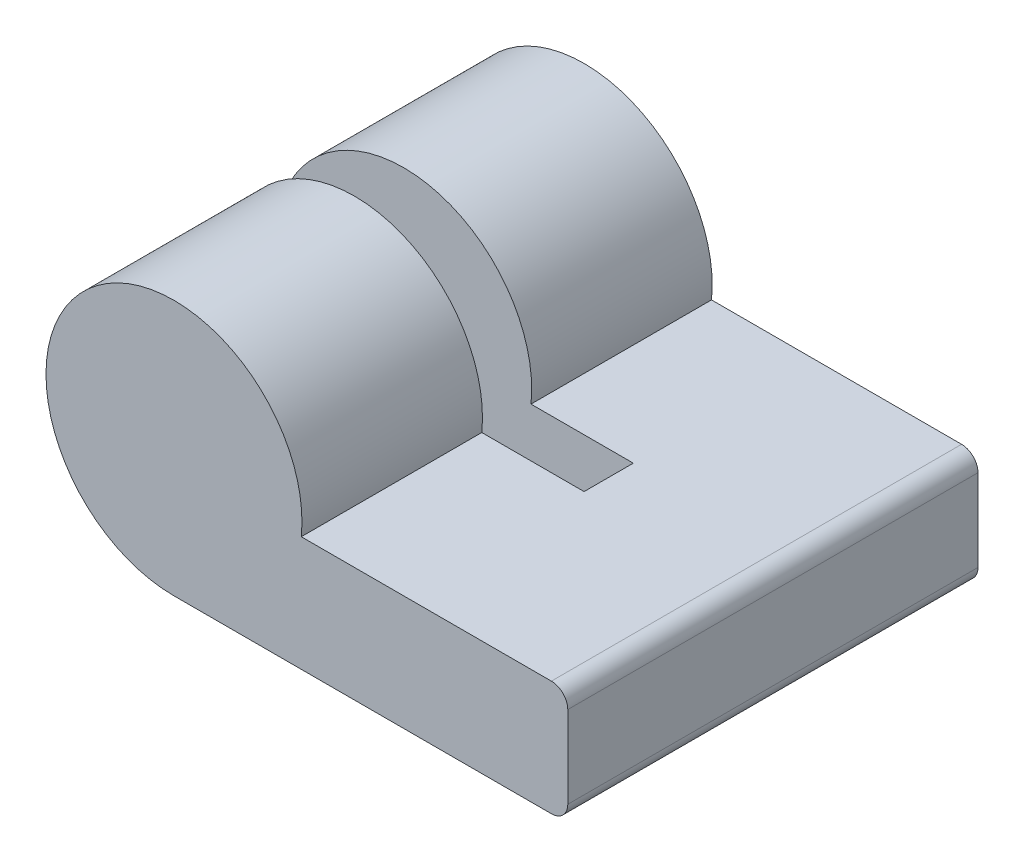
ISO-10303-21;
HEADER;
FILE_DESCRIPTION(('STEP AP214'),'2;1');
FILE_NAME('part.step','',(''),(''),'','','');
FILE_SCHEMA(('AUTOMOTIVE_DESIGN { 1 0 10303 214 1 1 1 1 }'));
ENDSEC;
DATA;
#1=APPLICATION_CONTEXT('core data for automotive mechanical design processes');
#2=APPLICATION_PROTOCOL_DEFINITION('international standard','automotive_design',2000,#1);
#3=PRODUCT_CONTEXT('',#1,'mechanical');
#4=PRODUCT('Part','Part','',(#3));
#5=PRODUCT_RELATED_PRODUCT_CATEGORY('part','',(#4));
#6=PRODUCT_DEFINITION_FORMATION('','',#4);
#7=PRODUCT_DEFINITION_CONTEXT('part definition',#1,'design');
#8=PRODUCT_DEFINITION('design','',#6,#7);
#9=PRODUCT_DEFINITION_SHAPE('','',#8);
#10=(LENGTH_UNIT() NAMED_UNIT(*) SI_UNIT(.MILLI.,.METRE.));
#11=(NAMED_UNIT(*) PLANE_ANGLE_UNIT() SI_UNIT($,.RADIAN.));
#12=(NAMED_UNIT(*) SI_UNIT($,.STERADIAN.) SOLID_ANGLE_UNIT());
#13=UNCERTAINTY_MEASURE_WITH_UNIT(LENGTH_MEASURE(1.E-05),#10,'distance_accuracy_value','');
#14=(GEOMETRIC_REPRESENTATION_CONTEXT(3) GLOBAL_UNCERTAINTY_ASSIGNED_CONTEXT((#13)) GLOBAL_UNIT_ASSIGNED_CONTEXT((#10,
#11,#12)) REPRESENTATION_CONTEXT('',''));
#15=CARTESIAN_POINT('',(0.,0.,0.));
#16=DIRECTION('',(0.,0.,1.));
#17=DIRECTION('',(1.,0.,0.));
#18=AXIS2_PLACEMENT_3D('',#15,#16,#17);
#19=CARTESIAN_POINT('',(0.,0.,12.5));
#20=DIRECTION('',(0.,0.,-1.));
#21=DIRECTION('',(-1.,0.,0.));
#22=AXIS2_PLACEMENT_3D('',#19,#20,#21);
#23=CYLINDRICAL_SURFACE('',#22,3.9);
#24=CARTESIAN_POINT('',(0.,0.,5.5));
#25=DIRECTION('',(0.,0.,1.));
#26=DIRECTION('',(1.,0.,0.));
#27=AXIS2_PLACEMENT_3D('',#24,#25,#26);
#28=CIRCLE('',#27,3.9);
#29=CARTESIAN_POINT('',(3.87943294825416,-0.400000000000001,5.5));
#30=VERTEX_POINT('',#29);
#31=CARTESIAN_POINT('',(0.,-3.9,5.5));
#32=VERTEX_POINT('',#31);
#33=EDGE_CURVE('E129',#30,#32,#28,.T.);
#34=ORIENTED_EDGE('',*,*,#33,.F.);
#35=DIRECTION('',(0.,0.,-1.));
#36=VECTOR('',#35,1.);
#37=CARTESIAN_POINT('',(3.87943294825416,-0.400000000000001,12.5));
#38=LINE('',#37,#36);
#39=CARTESIAN_POINT('',(3.87943294825416,-0.400000000000001,0.));
#40=VERTEX_POINT('',#39);
#41=EDGE_CURVE('E156',#30,#40,#38,.T.);
#42=ORIENTED_EDGE('',*,*,#41,.T.);
#43=CARTESIAN_POINT('',(0.,0.,0.));
#44=DIRECTION('',(0.,0.,1.));
#45=DIRECTION('',(1.,0.,0.));
#46=AXIS2_PLACEMENT_3D('',#43,#44,#45);
#47=CIRCLE('',#46,3.9);
#48=CARTESIAN_POINT('',(0.,-3.9,0.));
#49=VERTEX_POINT('',#48);
#50=EDGE_CURVE('E118',#40,#49,#47,.T.);
#51=ORIENTED_EDGE('',*,*,#50,.T.);
#52=DIRECTION('',(0.,0.,-1.));
#53=VECTOR('',#52,1.);
#54=CARTESIAN_POINT('',(0.,-3.9,12.5));
#55=LINE('',#54,#53);
#56=EDGE_CURVE('E160',#32,#49,#55,.T.);
#57=ORIENTED_EDGE('',*,*,#56,.F.);
#58=EDGE_LOOP('',(#34,#42,#51,#57));
#59=FACE_BOUND('',#58,.T.);
#60=ADVANCED_FACE('F31',(#59),#23,.T.);
#61=CARTESIAN_POINT('',(0.,-3.9,12.5));
#62=DIRECTION('',(0.,1.,0.));
#63=DIRECTION('',(0.,0.,1.));
#64=AXIS2_PLACEMENT_3D('',#61,#62,#63);
#65=PLANE('',#64);
#66=DIRECTION('',(1.,0.,0.));
#67=VECTOR('',#66,1.);
#68=CARTESIAN_POINT('',(0.,-3.9,5.5));
#69=LINE('',#68,#67);
#70=CARTESIAN_POINT('',(3.13256738578406,-3.9,5.5));
#71=VERTEX_POINT('',#70);
#72=EDGE_CURVE('E119',#32,#71,#69,.T.);
#73=ORIENTED_EDGE('',*,*,#72,.F.);
#74=ORIENTED_EDGE('',*,*,#56,.T.);
#75=DIRECTION('',(1.,0.,0.));
#76=VECTOR('',#75,1.);
#77=CARTESIAN_POINT('',(0.,-3.9,0.));
#78=LINE('',#77,#76);
#79=CARTESIAN_POINT('',(11.5,-3.9,0.));
#80=VERTEX_POINT('',#79);
#81=EDGE_CURVE('E138',#49,#80,#78,.T.);
#82=ORIENTED_EDGE('',*,*,#81,.T.);
#83=DIRECTION('',(0.,0.,-1.));
#84=VECTOR('',#83,1.);
#85=CARTESIAN_POINT('',(11.5,-3.9,12.5));
#86=LINE('',#85,#84);
#87=CARTESIAN_POINT('',(11.5,-3.9,12.5));
#88=VERTEX_POINT('',#87);
#89=EDGE_CURVE('E54',#80,#88,#86,.F.);
#90=ORIENTED_EDGE('',*,*,#89,.T.);
#91=DIRECTION('',(1.,0.,0.));
#92=VECTOR('',#91,1.);
#93=CARTESIAN_POINT('',(0.,-3.9,12.5));
#94=LINE('',#93,#92);
#95=CARTESIAN_POINT('',(0.,-3.9,12.5));
#96=VERTEX_POINT('',#95);
#97=EDGE_CURVE('E149',#96,#88,#94,.T.);
#98=ORIENTED_EDGE('',*,*,#97,.F.);
#99=CARTESIAN_POINT('',(0.,-3.9,7.));
#100=VERTEX_POINT('',#99);
#101=EDGE_CURVE('E128',#96,#100,#55,.T.);
#102=ORIENTED_EDGE('',*,*,#101,.T.);
#103=DIRECTION('',(1.,0.,0.));
#104=VECTOR('',#103,1.);
#105=CARTESIAN_POINT('',(0.,-3.9,7.));
#106=LINE('',#105,#104);
#107=CARTESIAN_POINT('',(3.13256738578406,-3.9,7.));
#108=VERTEX_POINT('',#107);
#109=EDGE_CURVE('E122',#100,#108,#106,.T.);
#110=ORIENTED_EDGE('',*,*,#109,.T.);
#111=DIRECTION('',(0.,0.,1.));
#112=VECTOR('',#111,1.);
#113=CARTESIAN_POINT('',(3.13256738578406,-3.9,5.5));
#114=LINE('',#113,#112);
#115=EDGE_CURVE('E109',#108,#71,#114,.F.);
#116=ORIENTED_EDGE('',*,*,#115,.T.);
#117=EDGE_LOOP('',(#73,#74,#82,#90,#98,#102,#110,#116));
#118=FACE_BOUND('',#117,.T.);
#119=ADVANCED_FACE('F126',(#118),#65,.F.);
#120=CARTESIAN_POINT('',(12.,-0.4,12.5));
#121=DIRECTION('',(0.,-1.,0.));
#122=DIRECTION('',(1.,0.,0.));
#123=AXIS2_PLACEMENT_3D('',#120,#121,#122);
#124=PLANE('',#123);
#125=DIRECTION('',(-1.,0.,0.));
#126=VECTOR('',#125,1.);
#127=CARTESIAN_POINT('',(12.,-0.4,5.5));
#128=LINE('',#127,#126);
#129=CARTESIAN_POINT('',(6.99636333578803,-0.400000000000002,5.5));
#130=VERTEX_POINT('',#129);
#131=EDGE_CURVE('E11',#130,#30,#128,.T.);
#132=ORIENTED_EDGE('',*,*,#131,.F.);
#133=DIRECTION('',(0.,0.,1.));
#134=VECTOR('',#133,1.);
#135=CARTESIAN_POINT('',(6.99636333578803,-0.400000000000002,5.5));
#136=LINE('',#135,#134);
#137=CARTESIAN_POINT('',(6.99636333578803,-0.400000000000002,7.));
#138=VERTEX_POINT('',#137);
#139=EDGE_CURVE('E39',#130,#138,#136,.T.);
#140=ORIENTED_EDGE('',*,*,#139,.T.);
#141=DIRECTION('',(-1.,0.,0.));
#142=VECTOR('',#141,1.);
#143=CARTESIAN_POINT('',(12.,-0.4,7.));
#144=LINE('',#143,#142);
#145=CARTESIAN_POINT('',(3.87943294825416,-0.400000000000001,7.));
#146=VERTEX_POINT('',#145);
#147=EDGE_CURVE('E123',#138,#146,#144,.T.);
#148=ORIENTED_EDGE('',*,*,#147,.T.);
#149=CARTESIAN_POINT('',(3.87943294825416,-0.400000000000001,12.5));
#150=VERTEX_POINT('',#149);
#151=EDGE_CURVE('E157',#150,#146,#38,.T.);
#152=ORIENTED_EDGE('',*,*,#151,.F.);
#153=DIRECTION('',(-1.,0.,0.));
#154=VECTOR('',#153,1.);
#155=CARTESIAN_POINT('',(12.,-0.4,12.5));
#156=LINE('',#155,#154);
#157=CARTESIAN_POINT('',(11.5,-0.4,12.5));
#158=VERTEX_POINT('',#157);
#159=EDGE_CURVE('E154',#158,#150,#156,.T.);
#160=ORIENTED_EDGE('',*,*,#159,.F.);
#161=DIRECTION('',(0.,0.,-1.));
#162=VECTOR('',#161,1.);
#163=CARTESIAN_POINT('',(11.5,-0.4,12.5));
#164=LINE('',#163,#162);
#165=CARTESIAN_POINT('',(11.5,-0.4,0.));
#166=VERTEX_POINT('',#165);
#167=EDGE_CURVE('E162',#158,#166,#164,.T.);
#168=ORIENTED_EDGE('',*,*,#167,.T.);
#169=DIRECTION('',(-1.,0.,0.));
#170=VECTOR('',#169,1.);
#171=CARTESIAN_POINT('',(12.,-0.4,0.));
#172=LINE('',#171,#170);
#173=EDGE_CURVE('E143',#166,#40,#172,.T.);
#174=ORIENTED_EDGE('',*,*,#173,.T.);
#175=ORIENTED_EDGE('',*,*,#41,.F.);
#176=EDGE_LOOP('',(#132,#140,#148,#152,#160,#168,#174,#175));
#177=FACE_BOUND('',#176,.T.);
#178=ADVANCED_FACE('F181',(#177),#124,.F.);
#179=ORIENTED_EDGE('',*,*,#151,.T.);
#180=CARTESIAN_POINT('',(0.,0.,7.));
#181=DIRECTION('',(0.,0.,1.));
#182=DIRECTION('',(1.,0.,0.));
#183=AXIS2_PLACEMENT_3D('',#180,#181,#182);
#184=CIRCLE('',#183,3.9);
#185=EDGE_CURVE('E46',#146,#100,#184,.T.);
#186=ORIENTED_EDGE('',*,*,#185,.T.);
#187=ORIENTED_EDGE('',*,*,#101,.F.);
#188=CARTESIAN_POINT('',(0.,0.,12.5));
#189=DIRECTION('',(0.,0.,1.));
#190=DIRECTION('',(1.,0.,0.));
#191=AXIS2_PLACEMENT_3D('',#188,#189,#190);
#192=CIRCLE('',#191,3.9);
#193=EDGE_CURVE('E146',#150,#96,#192,.T.);
#194=ORIENTED_EDGE('',*,*,#193,.F.);
#195=EDGE_LOOP('',(#179,#186,#187,#194));
#196=FACE_BOUND('',#195,.T.);
#197=ADVANCED_FACE('F33',(#196),#23,.T.);
#198=CARTESIAN_POINT('',(12.,-3.9,12.5));
#199=DIRECTION('',(-1.,0.,0.));
#200=DIRECTION('',(0.,0.,1.));
#201=AXIS2_PLACEMENT_3D('',#198,#199,#200);
#202=PLANE('',#201);
#203=DIRECTION('',(0.,1.,0.));
#204=VECTOR('',#203,1.);
#205=CARTESIAN_POINT('',(12.,-3.9,0.));
#206=LINE('',#205,#204);
#207=CARTESIAN_POINT('',(12.,-3.4,0.));
#208=VERTEX_POINT('',#207);
#209=CARTESIAN_POINT('',(12.,-0.9,0.));
#210=VERTEX_POINT('',#209);
#211=EDGE_CURVE('E140',#208,#210,#206,.T.);
#212=ORIENTED_EDGE('',*,*,#211,.T.);
#213=DIRECTION('',(0.,0.,-1.));
#214=VECTOR('',#213,1.);
#215=CARTESIAN_POINT('',(12.,-0.9,12.5));
#216=LINE('',#215,#214);
#217=CARTESIAN_POINT('',(12.,-0.9,12.5));
#218=VERTEX_POINT('',#217);
#219=EDGE_CURVE('E172',#210,#218,#216,.F.);
#220=ORIENTED_EDGE('',*,*,#219,.T.);
#221=DIRECTION('',(0.,1.,0.));
#222=VECTOR('',#221,1.);
#223=CARTESIAN_POINT('',(12.,-3.9,12.5));
#224=LINE('',#223,#222);
#225=CARTESIAN_POINT('',(12.,-3.4,12.5));
#226=VERTEX_POINT('',#225);
#227=EDGE_CURVE('E151',#226,#218,#224,.T.);
#228=ORIENTED_EDGE('',*,*,#227,.F.);
#229=DIRECTION('',(0.,0.,-1.));
#230=VECTOR('',#229,1.);
#231=CARTESIAN_POINT('',(12.,-3.4,12.5));
#232=LINE('',#231,#230);
#233=EDGE_CURVE('E169',#226,#208,#232,.T.);
#234=ORIENTED_EDGE('',*,*,#233,.T.);
#235=EDGE_LOOP('',(#212,#220,#228,#234));
#236=FACE_BOUND('',#235,.T.);
#237=ADVANCED_FACE('F204',(#236),#202,.F.);
#238=CARTESIAN_POINT('',(0.,0.,12.5));
#239=DIRECTION('',(0.,0.,1.));
#240=DIRECTION('',(1.,0.,0.));
#241=AXIS2_PLACEMENT_3D('',#238,#239,#240);
#242=PLANE('',#241);
#243=ORIENTED_EDGE('',*,*,#227,.T.);
#244=CARTESIAN_POINT('',(11.5,-0.9,12.5));
#245=DIRECTION('',(0.,0.,1.));
#246=DIRECTION('',(1.,0.,0.));
#247=AXIS2_PLACEMENT_3D('',#244,#245,#246);
#248=CIRCLE('',#247,0.5);
#249=EDGE_CURVE('E176',#218,#158,#248,.T.);
#250=ORIENTED_EDGE('',*,*,#249,.T.);
#251=ORIENTED_EDGE('',*,*,#159,.T.);
#252=ORIENTED_EDGE('',*,*,#193,.T.);
#253=ORIENTED_EDGE('',*,*,#97,.T.);
#254=CARTESIAN_POINT('',(11.5,-3.4,12.5));
#255=DIRECTION('',(0.,0.,1.));
#256=DIRECTION('',(1.,0.,0.));
#257=AXIS2_PLACEMENT_3D('',#254,#255,#256);
#258=CIRCLE('',#257,0.5);
#259=EDGE_CURVE('E174',#88,#226,#258,.T.);
#260=ORIENTED_EDGE('',*,*,#259,.T.);
#261=EDGE_LOOP('',(#243,#250,#251,#252,#253,#260));
#262=FACE_BOUND('',#261,.T.);
#263=ADVANCED_FACE('F201',(#262),#242,.T.);
#264=CARTESIAN_POINT('',(0.,0.,0.));
#265=DIRECTION('',(0.,0.,1.));
#266=DIRECTION('',(1.,0.,0.));
#267=AXIS2_PLACEMENT_3D('',#264,#265,#266);
#268=PLANE('',#267);
#269=ORIENTED_EDGE('',*,*,#173,.F.);
#270=CARTESIAN_POINT('',(11.5,-0.9,0.));
#271=DIRECTION('',(0.,0.,1.));
#272=DIRECTION('',(1.,0.,0.));
#273=AXIS2_PLACEMENT_3D('',#270,#271,#272);
#274=CIRCLE('',#273,0.5);
#275=EDGE_CURVE('E167',#166,#210,#274,.F.);
#276=ORIENTED_EDGE('',*,*,#275,.T.);
#277=ORIENTED_EDGE('',*,*,#211,.F.);
#278=CARTESIAN_POINT('',(11.5,-3.4,0.));
#279=DIRECTION('',(0.,0.,1.));
#280=DIRECTION('',(1.,0.,0.));
#281=AXIS2_PLACEMENT_3D('',#278,#279,#280);
#282=CIRCLE('',#281,0.5);
#283=EDGE_CURVE('E165',#208,#80,#282,.F.);
#284=ORIENTED_EDGE('',*,*,#283,.T.);
#285=ORIENTED_EDGE('',*,*,#81,.F.);
#286=ORIENTED_EDGE('',*,*,#50,.F.);
#287=EDGE_LOOP('',(#269,#276,#277,#284,#285,#286));
#288=FACE_BOUND('',#287,.T.);
#289=ADVANCED_FACE('F193',(#288),#268,.F.);
#290=CARTESIAN_POINT('',(11.5,-0.9,12.5));
#291=DIRECTION('',(0.,0.,-1.));
#292=DIRECTION('',(-1.,0.,0.));
#293=AXIS2_PLACEMENT_3D('',#290,#291,#292);
#294=CYLINDRICAL_SURFACE('',#293,0.5);
#295=ORIENTED_EDGE('',*,*,#249,.F.);
#296=ORIENTED_EDGE('',*,*,#219,.F.);
#297=ORIENTED_EDGE('',*,*,#275,.F.);
#298=ORIENTED_EDGE('',*,*,#167,.F.);
#299=EDGE_LOOP('',(#295,#296,#297,#298));
#300=FACE_BOUND('',#299,.T.);
#301=ADVANCED_FACE('F207',(#300),#294,.T.);
#302=CARTESIAN_POINT('',(11.5,-3.4,12.5));
#303=DIRECTION('',(0.,0.,-1.));
#304=DIRECTION('',(-1.,0.,0.));
#305=AXIS2_PLACEMENT_3D('',#302,#303,#304);
#306=CYLINDRICAL_SURFACE('',#305,0.5);
#307=ORIENTED_EDGE('',*,*,#259,.F.);
#308=ORIENTED_EDGE('',*,*,#89,.F.);
#309=ORIENTED_EDGE('',*,*,#283,.F.);
#310=ORIENTED_EDGE('',*,*,#233,.F.);
#311=EDGE_LOOP('',(#307,#308,#309,#310));
#312=FACE_BOUND('',#311,.T.);
#313=ADVANCED_FACE('F197',(#312),#306,.T.);
#314=CARTESIAN_POINT('',(-15.,20.,5.5));
#315=DIRECTION('',(0.,0.,1.));
#316=DIRECTION('',(1.,0.,0.));
#317=AXIS2_PLACEMENT_3D('',#314,#315,#316);
#318=CYLINDRICAL_SURFACE('',#317,30.);
#319=CARTESIAN_POINT('',(-15.,20.,7.));
#320=DIRECTION('',(0.,0.,1.));
#321=DIRECTION('',(1.,0.,0.));
#322=AXIS2_PLACEMENT_3D('',#319,#320,#321);
#323=CIRCLE('',#322,30.);
#324=EDGE_CURVE('E112',#108,#138,#323,.T.);
#325=ORIENTED_EDGE('',*,*,#324,.T.);
#326=ORIENTED_EDGE('',*,*,#139,.F.);
#327=CARTESIAN_POINT('',(-15.,20.,5.5));
#328=DIRECTION('',(0.,0.,1.));
#329=DIRECTION('',(1.,0.,0.));
#330=AXIS2_PLACEMENT_3D('',#327,#328,#329);
#331=CIRCLE('',#330,30.);
#332=EDGE_CURVE('E115',#71,#130,#331,.T.);
#333=ORIENTED_EDGE('',*,*,#332,.F.);
#334=ORIENTED_EDGE('',*,*,#115,.F.);
#335=EDGE_LOOP('',(#325,#326,#333,#334));
#336=FACE_BOUND('',#335,.T.);
#337=ADVANCED_FACE('F111',(#336),#318,.F.);
#338=CARTESIAN_POINT('',(-15.,20.,5.5));
#339=DIRECTION('',(0.,0.,1.));
#340=DIRECTION('',(1.,0.,0.));
#341=AXIS2_PLACEMENT_3D('',#338,#339,#340);
#342=PLANE('',#341);
#343=ORIENTED_EDGE('',*,*,#72,.T.);
#344=ORIENTED_EDGE('',*,*,#332,.T.);
#345=ORIENTED_EDGE('',*,*,#131,.T.);
#346=ORIENTED_EDGE('',*,*,#33,.T.);
#347=EDGE_LOOP('',(#343,#344,#345,#346));
#348=FACE_BOUND('',#347,.T.);
#349=ADVANCED_FACE('F185',(#348),#342,.T.);
#350=CARTESIAN_POINT('',(-15.,20.,7.));
#351=DIRECTION('',(0.,0.,1.));
#352=DIRECTION('',(1.,0.,0.));
#353=AXIS2_PLACEMENT_3D('',#350,#351,#352);
#354=PLANE('',#353);
#355=ORIENTED_EDGE('',*,*,#185,.F.);
#356=ORIENTED_EDGE('',*,*,#147,.F.);
#357=ORIENTED_EDGE('',*,*,#324,.F.);
#358=ORIENTED_EDGE('',*,*,#109,.F.);
#359=EDGE_LOOP('',(#355,#356,#357,#358));
#360=FACE_BOUND('',#359,.T.);
#361=ADVANCED_FACE('F121',(#360),#354,.F.);
#362=CLOSED_SHELL('',(#60,#119,#178,#197,#237,#263,#289,#301,#313,#337,#349,#361));
#363=MANIFOLD_SOLID_BREP('B2',#362);
#364=ADVANCED_BREP_SHAPE_REPRESENTATION('',(#18,#363),#14);
#365=SHAPE_DEFINITION_REPRESENTATION(#9,#364);
ENDSEC;
END-ISO-10303-21;
